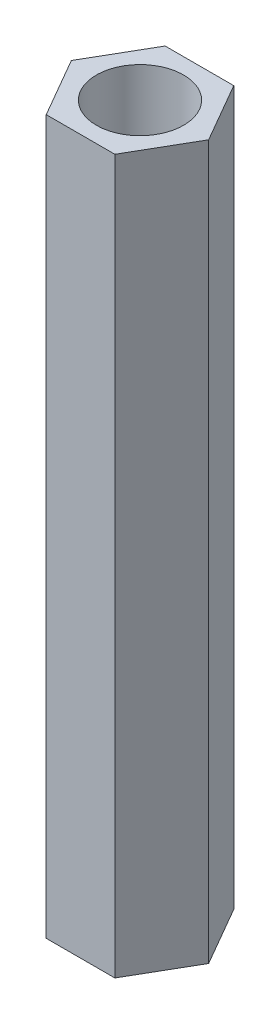
ISO-10303-21;
HEADER;
FILE_DESCRIPTION(('STEP AP214'),'2;1');
FILE_NAME('part.step','',(''),(''),'','','');
FILE_SCHEMA(('AUTOMOTIVE_DESIGN { 1 0 10303 214 1 1 1 1 }'));
ENDSEC;
DATA;
#1=APPLICATION_CONTEXT('core data for automotive mechanical design processes');
#2=APPLICATION_PROTOCOL_DEFINITION('international standard','automotive_design',2000,#1);
#3=PRODUCT_CONTEXT('',#1,'mechanical');
#4=PRODUCT('Part','Part','',(#3));
#5=PRODUCT_RELATED_PRODUCT_CATEGORY('part','',(#4));
#6=PRODUCT_DEFINITION_FORMATION('','',#4);
#7=PRODUCT_DEFINITION_CONTEXT('part definition',#1,'design');
#8=PRODUCT_DEFINITION('design','',#6,#7);
#9=PRODUCT_DEFINITION_SHAPE('','',#8);
#10=(LENGTH_UNIT() NAMED_UNIT(*) SI_UNIT(.MILLI.,.METRE.));
#11=(NAMED_UNIT(*) PLANE_ANGLE_UNIT() SI_UNIT($,.RADIAN.));
#12=(NAMED_UNIT(*) SI_UNIT($,.STERADIAN.) SOLID_ANGLE_UNIT());
#13=UNCERTAINTY_MEASURE_WITH_UNIT(LENGTH_MEASURE(1.E-05),#10,'distance_accuracy_value','');
#14=(GEOMETRIC_REPRESENTATION_CONTEXT(3) GLOBAL_UNCERTAINTY_ASSIGNED_CONTEXT((#13)) GLOBAL_UNIT_ASSIGNED_CONTEXT((#10,
#11,#12)) REPRESENTATION_CONTEXT('',''));
#15=CARTESIAN_POINT('',(0.,0.,0.));
#16=DIRECTION('',(0.,0.,1.));
#17=DIRECTION('',(1.,0.,0.));
#18=AXIS2_PLACEMENT_3D('',#15,#16,#17);
#19=CARTESIAN_POINT('',(0.,18.,0.));
#20=DIRECTION('',(0.,1.,0.));
#21=DIRECTION('',(0.,0.,1.));
#22=AXIS2_PLACEMENT_3D('',#19,#20,#21);
#23=PLANE('',#22);
#24=DIRECTION('',(1.,0.,0.));
#25=VECTOR('',#24,1.);
#26=CARTESIAN_POINT('',(-0.866025403784437,18.,1.5));
#27=LINE('',#26,#25);
#28=CARTESIAN_POINT('',(-0.866025403784437,18.,1.5));
#29=VERTEX_POINT('',#28);
#30=CARTESIAN_POINT('',(0.866025403784439,18.,1.5));
#31=VERTEX_POINT('',#30);
#32=EDGE_CURVE('E129',#29,#31,#27,.T.);
#33=ORIENTED_EDGE('',*,*,#32,.T.);
#34=DIRECTION('',(0.5,0.,-0.866025403784439));
#35=VECTOR('',#34,1.);
#36=CARTESIAN_POINT('',(0.866025403784439,18.,1.5));
#37=LINE('',#36,#35);
#38=CARTESIAN_POINT('',(1.73205080756888,18.,0.));
#39=VERTEX_POINT('',#38);
#40=EDGE_CURVE('E87',#31,#39,#37,.T.);
#41=ORIENTED_EDGE('',*,*,#40,.T.);
#42=DIRECTION('',(-0.5,0.,-0.866025403784438));
#43=VECTOR('',#42,1.);
#44=CARTESIAN_POINT('',(1.73205080756888,18.,0.));
#45=LINE('',#44,#43);
#46=CARTESIAN_POINT('',(0.866025403784438,18.,-1.5));
#47=VERTEX_POINT('',#46);
#48=EDGE_CURVE('E100',#39,#47,#45,.T.);
#49=ORIENTED_EDGE('',*,*,#48,.T.);
#50=DIRECTION('',(-1.,0.,0.));
#51=VECTOR('',#50,1.);
#52=CARTESIAN_POINT('',(0.866025403784438,18.,-1.5));
#53=LINE('',#52,#51);
#54=CARTESIAN_POINT('',(-0.866025403784438,18.,-1.5));
#55=VERTEX_POINT('',#54);
#56=EDGE_CURVE('E94',#47,#55,#53,.T.);
#57=ORIENTED_EDGE('',*,*,#56,.T.);
#58=DIRECTION('',(-0.5,0.,0.866025403784439));
#59=VECTOR('',#58,1.);
#60=CARTESIAN_POINT('',(-0.866025403784438,18.,-1.5));
#61=LINE('',#60,#59);
#62=CARTESIAN_POINT('',(-1.73205080756888,18.,0.));
#63=VERTEX_POINT('',#62);
#64=EDGE_CURVE('E98',#55,#63,#61,.T.);
#65=ORIENTED_EDGE('',*,*,#64,.T.);
#66=DIRECTION('',(0.5,0.,0.866025403784439));
#67=VECTOR('',#66,1.);
#68=CARTESIAN_POINT('',(-1.73205080756888,18.,0.));
#69=LINE('',#68,#67);
#70=EDGE_CURVE('E50',#63,#29,#69,.T.);
#71=ORIENTED_EDGE('',*,*,#70,.T.);
#72=EDGE_LOOP('',(#33,#41,#49,#57,#65,#71));
#73=FACE_BOUND('',#72,.T.);
#74=CARTESIAN_POINT('',(0.,18.,0.));
#75=DIRECTION('',(0.,1.,0.));
#76=DIRECTION('',(0.,0.,1.));
#77=AXIS2_PLACEMENT_3D('',#74,#75,#76);
#78=CIRCLE('',#77,1.1);
#79=CARTESIAN_POINT('',(0.,18.,1.1));
#80=VERTEX_POINT('',#79);
#81=EDGE_CURVE('E122',#80,#80,#78,.T.);
#82=ORIENTED_EDGE('',*,*,#81,.F.);
#83=EDGE_LOOP('',(#82));
#84=FACE_BOUND('',#83,.T.);
#85=ADVANCED_FACE('F33',(#73,#84),#23,.T.);
#86=CARTESIAN_POINT('',(0.,0.,0.));
#87=DIRECTION('',(0.,1.,0.));
#88=DIRECTION('',(0.,0.,1.));
#89=AXIS2_PLACEMENT_3D('',#86,#87,#88);
#90=PLANE('',#89);
#91=DIRECTION('',(1.,0.,0.));
#92=VECTOR('',#91,1.);
#93=CARTESIAN_POINT('',(-0.866025403784437,0.,1.5));
#94=LINE('',#93,#92);
#95=CARTESIAN_POINT('',(-0.866025403784437,0.,1.5));
#96=VERTEX_POINT('',#95);
#97=CARTESIAN_POINT('',(0.866025403784439,0.,1.5));
#98=VERTEX_POINT('',#97);
#99=EDGE_CURVE('E118',#96,#98,#94,.T.);
#100=ORIENTED_EDGE('',*,*,#99,.F.);
#101=DIRECTION('',(0.5,0.,0.866025403784439));
#102=VECTOR('',#101,1.);
#103=CARTESIAN_POINT('',(-1.73205080756888,0.,0.));
#104=LINE('',#103,#102);
#105=CARTESIAN_POINT('',(-1.73205080756888,0.,0.));
#106=VERTEX_POINT('',#105);
#107=EDGE_CURVE('E79',#106,#96,#104,.T.);
#108=ORIENTED_EDGE('',*,*,#107,.F.);
#109=DIRECTION('',(-0.5,0.,0.866025403784439));
#110=VECTOR('',#109,1.);
#111=CARTESIAN_POINT('',(-0.866025403784438,0.,-1.5));
#112=LINE('',#111,#110);
#113=CARTESIAN_POINT('',(-0.866025403784438,0.,-1.5));
#114=VERTEX_POINT('',#113);
#115=EDGE_CURVE('E73',#114,#106,#112,.T.);
#116=ORIENTED_EDGE('',*,*,#115,.F.);
#117=DIRECTION('',(-1.,0.,0.));
#118=VECTOR('',#117,1.);
#119=CARTESIAN_POINT('',(0.866025403784438,0.,-1.5));
#120=LINE('',#119,#118);
#121=CARTESIAN_POINT('',(0.866025403784438,0.,-1.5));
#122=VERTEX_POINT('',#121);
#123=EDGE_CURVE('E108',#122,#114,#120,.T.);
#124=ORIENTED_EDGE('',*,*,#123,.F.);
#125=DIRECTION('',(-0.5,0.,-0.866025403784438));
#126=VECTOR('',#125,1.);
#127=CARTESIAN_POINT('',(1.73205080756888,0.,0.));
#128=LINE('',#127,#126);
#129=CARTESIAN_POINT('',(1.73205080756888,0.,0.));
#130=VERTEX_POINT('',#129);
#131=EDGE_CURVE('E124',#130,#122,#128,.T.);
#132=ORIENTED_EDGE('',*,*,#131,.F.);
#133=DIRECTION('',(0.5,0.,-0.866025403784439));
#134=VECTOR('',#133,1.);
#135=CARTESIAN_POINT('',(0.866025403784439,0.,1.5));
#136=LINE('',#135,#134);
#137=EDGE_CURVE('E121',#98,#130,#136,.T.);
#138=ORIENTED_EDGE('',*,*,#137,.F.);
#139=EDGE_LOOP('',(#100,#108,#116,#124,#132,#138));
#140=FACE_BOUND('',#139,.T.);
#141=CARTESIAN_POINT('',(0.,0.,0.));
#142=DIRECTION('',(0.,1.,0.));
#143=DIRECTION('',(0.,0.,1.));
#144=AXIS2_PLACEMENT_3D('',#141,#142,#143);
#145=CIRCLE('',#144,1.1);
#146=CARTESIAN_POINT('',(0.,0.,1.1));
#147=VERTEX_POINT('',#146);
#148=EDGE_CURVE('E222',#147,#147,#145,.T.);
#149=ORIENTED_EDGE('',*,*,#148,.T.);
#150=EDGE_LOOP('',(#149));
#151=FACE_BOUND('',#150,.T.);
#152=ADVANCED_FACE('F138',(#140,#151),#90,.F.);
#153=CARTESIAN_POINT('',(-0.866025403784437,18.,1.5));
#154=DIRECTION('',(0.,0.,-1.));
#155=DIRECTION('',(-1.,0.,0.));
#156=AXIS2_PLACEMENT_3D('',#153,#154,#155);
#157=PLANE('',#156);
#158=ORIENTED_EDGE('',*,*,#99,.T.);
#159=DIRECTION('',(0.,-1.,0.));
#160=VECTOR('',#159,1.);
#161=CARTESIAN_POINT('',(0.866025403784439,18.,1.5));
#162=LINE('',#161,#160);
#163=EDGE_CURVE('E11',#31,#98,#162,.T.);
#164=ORIENTED_EDGE('',*,*,#163,.F.);
#165=ORIENTED_EDGE('',*,*,#32,.F.);
#166=DIRECTION('',(0.,-1.,0.));
#167=VECTOR('',#166,1.);
#168=CARTESIAN_POINT('',(-0.866025403784437,18.,1.5));
#169=LINE('',#168,#167);
#170=EDGE_CURVE('E114',#29,#96,#169,.T.);
#171=ORIENTED_EDGE('',*,*,#170,.T.);
#172=EDGE_LOOP('',(#158,#164,#165,#171));
#173=FACE_BOUND('',#172,.T.);
#174=ADVANCED_FACE('F35',(#173),#157,.F.);
#175=CARTESIAN_POINT('',(0.866025403784439,18.,1.5));
#176=DIRECTION('',(-0.866025403784439,0.,-0.5));
#177=DIRECTION('',(-0.5,0.,0.866025403784439));
#178=AXIS2_PLACEMENT_3D('',#175,#176,#177);
#179=PLANE('',#178);
#180=ORIENTED_EDGE('',*,*,#137,.T.);
#181=DIRECTION('',(0.,-1.,0.));
#182=VECTOR('',#181,1.);
#183=CARTESIAN_POINT('',(1.73205080756888,18.,0.));
#184=LINE('',#183,#182);
#185=EDGE_CURVE('E42',#39,#130,#184,.T.);
#186=ORIENTED_EDGE('',*,*,#185,.F.);
#187=ORIENTED_EDGE('',*,*,#40,.F.);
#188=ORIENTED_EDGE('',*,*,#163,.T.);
#189=EDGE_LOOP('',(#180,#186,#187,#188));
#190=FACE_BOUND('',#189,.T.);
#191=ADVANCED_FACE('F163',(#190),#179,.F.);
#192=CARTESIAN_POINT('',(1.73205080756888,18.,0.));
#193=DIRECTION('',(-0.866025403784438,0.,0.5));
#194=DIRECTION('',(0.5,0.,0.866025403784439));
#195=AXIS2_PLACEMENT_3D('',#192,#193,#194);
#196=PLANE('',#195);
#197=ORIENTED_EDGE('',*,*,#131,.T.);
#198=DIRECTION('',(0.,-1.,0.));
#199=VECTOR('',#198,1.);
#200=CARTESIAN_POINT('',(0.866025403784438,18.,-1.5));
#201=LINE('',#200,#199);
#202=EDGE_CURVE('E109',#47,#122,#201,.T.);
#203=ORIENTED_EDGE('',*,*,#202,.F.);
#204=ORIENTED_EDGE('',*,*,#48,.F.);
#205=ORIENTED_EDGE('',*,*,#185,.T.);
#206=EDGE_LOOP('',(#197,#203,#204,#205));
#207=FACE_BOUND('',#206,.T.);
#208=ADVANCED_FACE('F135',(#207),#196,.F.);
#209=CARTESIAN_POINT('',(0.866025403784438,18.,-1.5));
#210=DIRECTION('',(0.,0.,1.));
#211=DIRECTION('',(1.,0.,0.));
#212=AXIS2_PLACEMENT_3D('',#209,#210,#211);
#213=PLANE('',#212);
#214=ORIENTED_EDGE('',*,*,#123,.T.);
#215=DIRECTION('',(0.,-1.,0.));
#216=VECTOR('',#215,1.);
#217=CARTESIAN_POINT('',(-0.866025403784438,18.,-1.5));
#218=LINE('',#217,#216);
#219=EDGE_CURVE('E105',#55,#114,#218,.T.);
#220=ORIENTED_EDGE('',*,*,#219,.F.);
#221=ORIENTED_EDGE('',*,*,#56,.F.);
#222=ORIENTED_EDGE('',*,*,#202,.T.);
#223=EDGE_LOOP('',(#214,#220,#221,#222));
#224=FACE_BOUND('',#223,.T.);
#225=ADVANCED_FACE('F106',(#224),#213,.F.);
#226=CARTESIAN_POINT('',(-0.866025403784438,18.,-1.5));
#227=DIRECTION('',(0.866025403784439,0.,0.5));
#228=DIRECTION('',(0.5,0.,-0.866025403784439));
#229=AXIS2_PLACEMENT_3D('',#226,#227,#228);
#230=PLANE('',#229);
#231=ORIENTED_EDGE('',*,*,#115,.T.);
#232=DIRECTION('',(0.,-1.,0.));
#233=VECTOR('',#232,1.);
#234=CARTESIAN_POINT('',(-1.73205080756888,18.,0.));
#235=LINE('',#234,#233);
#236=EDGE_CURVE('E110',#63,#106,#235,.T.);
#237=ORIENTED_EDGE('',*,*,#236,.F.);
#238=ORIENTED_EDGE('',*,*,#64,.F.);
#239=ORIENTED_EDGE('',*,*,#219,.T.);
#240=EDGE_LOOP('',(#231,#237,#238,#239));
#241=FACE_BOUND('',#240,.T.);
#242=ADVANCED_FACE('F112',(#241),#230,.F.);
#243=CARTESIAN_POINT('',(-1.73205080756888,18.,0.));
#244=DIRECTION('',(0.866025403784438,0.,-0.5));
#245=DIRECTION('',(-0.5,0.,-0.866025403784439));
#246=AXIS2_PLACEMENT_3D('',#243,#244,#245);
#247=PLANE('',#246);
#248=ORIENTED_EDGE('',*,*,#107,.T.);
#249=ORIENTED_EDGE('',*,*,#170,.F.);
#250=ORIENTED_EDGE('',*,*,#70,.F.);
#251=ORIENTED_EDGE('',*,*,#236,.T.);
#252=EDGE_LOOP('',(#248,#249,#250,#251));
#253=FACE_BOUND('',#252,.T.);
#254=ADVANCED_FACE('F143',(#253),#247,.F.);
#255=CARTESIAN_POINT('',(0.,18.,0.));
#256=DIRECTION('',(0.,-1.,0.));
#257=DIRECTION('',(0.,0.,-1.));
#258=AXIS2_PLACEMENT_3D('',#255,#256,#257);
#259=CYLINDRICAL_SURFACE('',#258,1.1);
#260=ORIENTED_EDGE('',*,*,#81,.T.);
#261=EDGE_LOOP('',(#260));
#262=FACE_BOUND('',#261,.T.);
#263=ORIENTED_EDGE('',*,*,#148,.F.);
#264=EDGE_LOOP('',(#263));
#265=FACE_BOUND('',#264,.T.);
#266=ADVANCED_FACE('F145',(#262,#265),#259,.F.);
#267=CLOSED_SHELL('',(#85,#152,#174,#191,#208,#225,#242,#254,#266));
#268=MANIFOLD_SOLID_BREP('B2',#267);
#269=ADVANCED_BREP_SHAPE_REPRESENTATION('',(#18,#268),#14);
#270=SHAPE_DEFINITION_REPRESENTATION(#9,#269);
ENDSEC;
END-ISO-10303-21;
